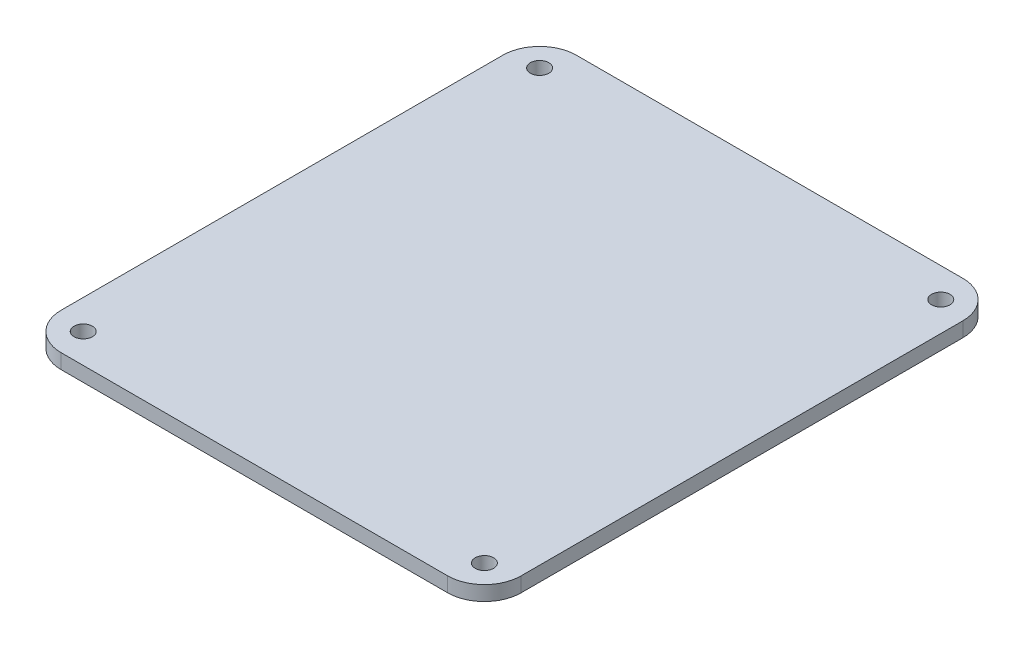
ISO-10303-21;
HEADER;
FILE_DESCRIPTION(('STEP AP214'),'2;1');
FILE_NAME('part.step','',(''),(''),'','','');
FILE_SCHEMA(('AUTOMOTIVE_DESIGN { 1 0 10303 214 1 1 1 1 }'));
ENDSEC;
DATA;
#1=APPLICATION_CONTEXT('core data for automotive mechanical design processes');
#2=APPLICATION_PROTOCOL_DEFINITION('international standard','automotive_design',2000,#1);
#3=PRODUCT_CONTEXT('',#1,'mechanical');
#4=PRODUCT('Part','Part','',(#3));
#5=PRODUCT_RELATED_PRODUCT_CATEGORY('part','',(#4));
#6=PRODUCT_DEFINITION_FORMATION('','',#4);
#7=PRODUCT_DEFINITION_CONTEXT('part definition',#1,'design');
#8=PRODUCT_DEFINITION('design','',#6,#7);
#9=PRODUCT_DEFINITION_SHAPE('','',#8);
#10=(LENGTH_UNIT() NAMED_UNIT(*) SI_UNIT(.MILLI.,.METRE.));
#11=(NAMED_UNIT(*) PLANE_ANGLE_UNIT() SI_UNIT($,.RADIAN.));
#12=(NAMED_UNIT(*) SI_UNIT($,.STERADIAN.) SOLID_ANGLE_UNIT());
#13=UNCERTAINTY_MEASURE_WITH_UNIT(LENGTH_MEASURE(1.E-05),#10,'distance_accuracy_value','');
#14=(GEOMETRIC_REPRESENTATION_CONTEXT(3) GLOBAL_UNCERTAINTY_ASSIGNED_CONTEXT((#13)) GLOBAL_UNIT_ASSIGNED_CONTEXT((#10,
#11,#12)) REPRESENTATION_CONTEXT('',''));
#15=CARTESIAN_POINT('',(0.,0.,0.));
#16=DIRECTION('',(0.,0.,1.));
#17=DIRECTION('',(1.,0.,0.));
#18=AXIS2_PLACEMENT_3D('',#15,#16,#17);
#19=CARTESIAN_POINT('',(62.5,4.,70.));
#20=DIRECTION('',(-1.,0.,0.));
#21=DIRECTION('',(0.,0.,1.));
#22=AXIS2_PLACEMENT_3D('',#19,#20,#21);
#23=PLANE('',#22);
#24=DIRECTION('',(0.,0.,-1.));
#25=VECTOR('',#24,1.);
#26=CARTESIAN_POINT('',(62.5,4.,70.));
#27=LINE('',#26,#25);
#28=CARTESIAN_POINT('',(62.5,4.,60.));
#29=VERTEX_POINT('',#28);
#30=CARTESIAN_POINT('',(62.5,4.,-60.));
#31=VERTEX_POINT('',#30);
#32=EDGE_CURVE('E126',#29,#31,#27,.T.);
#33=ORIENTED_EDGE('',*,*,#32,.F.);
#34=DIRECTION('',(0.,-1.,0.));
#35=VECTOR('',#34,1.);
#36=CARTESIAN_POINT('',(62.5,4.,60.));
#37=LINE('',#36,#35);
#38=CARTESIAN_POINT('',(62.5,0.,60.));
#39=VERTEX_POINT('',#38);
#40=EDGE_CURVE('E110',#29,#39,#37,.T.);
#41=ORIENTED_EDGE('',*,*,#40,.T.);
#42=DIRECTION('',(0.,0.,-1.));
#43=VECTOR('',#42,1.);
#44=CARTESIAN_POINT('',(62.5,0.,70.));
#45=LINE('',#44,#43);
#46=CARTESIAN_POINT('',(62.5,0.,-60.));
#47=VERTEX_POINT('',#46);
#48=EDGE_CURVE('E123',#39,#47,#45,.T.);
#49=ORIENTED_EDGE('',*,*,#48,.T.);
#50=DIRECTION('',(0.,-1.,0.));
#51=VECTOR('',#50,1.);
#52=CARTESIAN_POINT('',(62.5,4.,-60.));
#53=LINE('',#52,#51);
#54=EDGE_CURVE('E129',#47,#31,#53,.F.);
#55=ORIENTED_EDGE('',*,*,#54,.T.);
#56=EDGE_LOOP('',(#33,#41,#49,#55));
#57=FACE_BOUND('',#56,.T.);
#58=ADVANCED_FACE('F39',(#57),#23,.F.);
#59=CARTESIAN_POINT('',(-62.5,4.,-70.));
#60=DIRECTION('',(0.,0.,1.));
#61=DIRECTION('',(1.,0.,0.));
#62=AXIS2_PLACEMENT_3D('',#59,#60,#61);
#63=PLANE('',#62);
#64=DIRECTION('',(-1.,0.,0.));
#65=VECTOR('',#64,1.);
#66=CARTESIAN_POINT('',(-62.5,0.,-70.));
#67=LINE('',#66,#65);
#68=CARTESIAN_POINT('',(52.5,0.,-70.));
#69=VERTEX_POINT('',#68);
#70=CARTESIAN_POINT('',(-52.5,0.,-70.));
#71=VERTEX_POINT('',#70);
#72=EDGE_CURVE('E134',#69,#71,#67,.T.);
#73=ORIENTED_EDGE('',*,*,#72,.T.);
#74=DIRECTION('',(0.,-1.,0.));
#75=VECTOR('',#74,1.);
#76=CARTESIAN_POINT('',(-52.5,4.,-70.));
#77=LINE('',#76,#75);
#78=CARTESIAN_POINT('',(-52.5,4.,-70.));
#79=VERTEX_POINT('',#78);
#80=EDGE_CURVE('E11',#71,#79,#77,.F.);
#81=ORIENTED_EDGE('',*,*,#80,.T.);
#82=DIRECTION('',(-1.,0.,0.));
#83=VECTOR('',#82,1.);
#84=CARTESIAN_POINT('',(-62.5,4.,-70.));
#85=LINE('',#84,#83);
#86=CARTESIAN_POINT('',(52.5,4.,-70.));
#87=VERTEX_POINT('',#86);
#88=EDGE_CURVE('E191',#87,#79,#85,.T.);
#89=ORIENTED_EDGE('',*,*,#88,.F.);
#90=DIRECTION('',(0.,-1.,0.));
#91=VECTOR('',#90,1.);
#92=CARTESIAN_POINT('',(52.5,4.,-70.));
#93=LINE('',#92,#91);
#94=EDGE_CURVE('E48',#87,#69,#93,.T.);
#95=ORIENTED_EDGE('',*,*,#94,.T.);
#96=EDGE_LOOP('',(#73,#81,#89,#95));
#97=FACE_BOUND('',#96,.T.);
#98=ADVANCED_FACE('F189',(#97),#63,.F.);
#99=CARTESIAN_POINT('',(-62.5,4.,70.));
#100=DIRECTION('',(1.,0.,0.));
#101=DIRECTION('',(0.,0.,-1.));
#102=AXIS2_PLACEMENT_3D('',#99,#100,#101);
#103=PLANE('',#102);
#104=DIRECTION('',(0.,0.,1.));
#105=VECTOR('',#104,1.);
#106=CARTESIAN_POINT('',(-62.5,0.,70.));
#107=LINE('',#106,#105);
#108=CARTESIAN_POINT('',(-62.5,0.,-60.));
#109=VERTEX_POINT('',#108);
#110=CARTESIAN_POINT('',(-62.5,0.,60.));
#111=VERTEX_POINT('',#110);
#112=EDGE_CURVE('E140',#109,#111,#107,.T.);
#113=ORIENTED_EDGE('',*,*,#112,.T.);
#114=DIRECTION('',(0.,-1.,0.));
#115=VECTOR('',#114,1.);
#116=CARTESIAN_POINT('',(-62.5,4.,60.));
#117=LINE('',#116,#115);
#118=CARTESIAN_POINT('',(-62.5,4.,60.));
#119=VERTEX_POINT('',#118);
#120=EDGE_CURVE('E55',#111,#119,#117,.F.);
#121=ORIENTED_EDGE('',*,*,#120,.T.);
#122=DIRECTION('',(0.,0.,1.));
#123=VECTOR('',#122,1.);
#124=CARTESIAN_POINT('',(-62.5,4.,70.));
#125=LINE('',#124,#123);
#126=CARTESIAN_POINT('',(-62.5,4.,-60.));
#127=VERTEX_POINT('',#126);
#128=EDGE_CURVE('E199',#127,#119,#125,.T.);
#129=ORIENTED_EDGE('',*,*,#128,.F.);
#130=DIRECTION('',(0.,-1.,0.));
#131=VECTOR('',#130,1.);
#132=CARTESIAN_POINT('',(-62.5,4.,-60.));
#133=LINE('',#132,#131);
#134=EDGE_CURVE('E179',#127,#109,#133,.T.);
#135=ORIENTED_EDGE('',*,*,#134,.T.);
#136=EDGE_LOOP('',(#113,#121,#129,#135));
#137=FACE_BOUND('',#136,.T.);
#138=ADVANCED_FACE('F198',(#137),#103,.F.);
#139=CARTESIAN_POINT('',(-62.5,4.,70.));
#140=DIRECTION('',(0.,0.,-1.));
#141=DIRECTION('',(-1.,0.,0.));
#142=AXIS2_PLACEMENT_3D('',#139,#140,#141);
#143=PLANE('',#142);
#144=DIRECTION('',(1.,0.,0.));
#145=VECTOR('',#144,1.);
#146=CARTESIAN_POINT('',(-62.5,0.,70.));
#147=LINE('',#146,#145);
#148=CARTESIAN_POINT('',(-52.5,0.,70.));
#149=VERTEX_POINT('',#148);
#150=CARTESIAN_POINT('',(52.5,0.,70.));
#151=VERTEX_POINT('',#150);
#152=EDGE_CURVE('E151',#149,#151,#147,.T.);
#153=ORIENTED_EDGE('',*,*,#152,.T.);
#154=DIRECTION('',(0.,-1.,0.));
#155=VECTOR('',#154,1.);
#156=CARTESIAN_POINT('',(52.5,4.,70.));
#157=LINE('',#156,#155);
#158=CARTESIAN_POINT('',(52.5,4.,70.));
#159=VERTEX_POINT('',#158);
#160=EDGE_CURVE('E111',#151,#159,#157,.F.);
#161=ORIENTED_EDGE('',*,*,#160,.T.);
#162=DIRECTION('',(1.,0.,0.));
#163=VECTOR('',#162,1.);
#164=CARTESIAN_POINT('',(-62.5,4.,70.));
#165=LINE('',#164,#163);
#166=CARTESIAN_POINT('',(-52.5,4.,70.));
#167=VERTEX_POINT('',#166);
#168=EDGE_CURVE('E146',#167,#159,#165,.T.);
#169=ORIENTED_EDGE('',*,*,#168,.F.);
#170=DIRECTION('',(0.,-1.,0.));
#171=VECTOR('',#170,1.);
#172=CARTESIAN_POINT('',(-52.5,4.,70.));
#173=LINE('',#172,#171);
#174=EDGE_CURVE('E117',#167,#149,#173,.T.);
#175=ORIENTED_EDGE('',*,*,#174,.T.);
#176=EDGE_LOOP('',(#153,#161,#169,#175));
#177=FACE_BOUND('',#176,.T.);
#178=ADVANCED_FACE('F242',(#177),#143,.F.);
#179=CARTESIAN_POINT('',(0.,4.,0.));
#180=DIRECTION('',(0.,-1.,0.));
#181=DIRECTION('',(0.,0.,-1.));
#182=AXIS2_PLACEMENT_3D('',#179,#180,#181);
#183=PLANE('',#182);
#184=CARTESIAN_POINT('',(54.5,4.,-62.));
#185=DIRECTION('',(0.,1.,0.));
#186=DIRECTION('',(0.,0.,1.));
#187=AXIS2_PLACEMENT_3D('',#184,#185,#186);
#188=CIRCLE('',#187,2.5);
#189=CARTESIAN_POINT('',(54.5,4.,-59.5));
#190=VERTEX_POINT('',#189);
#191=EDGE_CURVE('E211',#190,#190,#188,.T.);
#192=ORIENTED_EDGE('',*,*,#191,.F.);
#193=EDGE_LOOP('',(#192));
#194=FACE_BOUND('',#193,.T.);
#195=CARTESIAN_POINT('',(-54.5,4.,62.));
#196=DIRECTION('',(0.,1.,0.));
#197=DIRECTION('',(0.,0.,1.));
#198=AXIS2_PLACEMENT_3D('',#195,#196,#197);
#199=CIRCLE('',#198,2.5);
#200=CARTESIAN_POINT('',(-54.5,4.,64.5));
#201=VERTEX_POINT('',#200);
#202=EDGE_CURVE('E217',#201,#201,#199,.T.);
#203=ORIENTED_EDGE('',*,*,#202,.F.);
#204=EDGE_LOOP('',(#203));
#205=FACE_BOUND('',#204,.T.);
#206=CARTESIAN_POINT('',(54.5,4.,62.));
#207=DIRECTION('',(0.,1.,0.));
#208=DIRECTION('',(0.,0.,1.));
#209=AXIS2_PLACEMENT_3D('',#206,#207,#208);
#210=CIRCLE('',#209,2.5);
#211=CARTESIAN_POINT('',(54.5,4.,64.5));
#212=VERTEX_POINT('',#211);
#213=EDGE_CURVE('E218',#212,#212,#210,.T.);
#214=ORIENTED_EDGE('',*,*,#213,.F.);
#215=EDGE_LOOP('',(#214));
#216=FACE_BOUND('',#215,.T.);
#217=CARTESIAN_POINT('',(-54.5,4.,-62.));
#218=DIRECTION('',(0.,1.,0.));
#219=DIRECTION('',(0.,0.,1.));
#220=AXIS2_PLACEMENT_3D('',#217,#218,#219);
#221=CIRCLE('',#220,2.5);
#222=CARTESIAN_POINT('',(-54.5,4.,-59.5));
#223=VERTEX_POINT('',#222);
#224=EDGE_CURVE('E143',#223,#223,#221,.T.);
#225=ORIENTED_EDGE('',*,*,#224,.F.);
#226=EDGE_LOOP('',(#225));
#227=FACE_BOUND('',#226,.T.);
#228=ORIENTED_EDGE('',*,*,#168,.T.);
#229=CARTESIAN_POINT('',(52.5,4.,60.));
#230=DIRECTION('',(0.,-1.,0.));
#231=DIRECTION('',(0.,0.,-1.));
#232=AXIS2_PLACEMENT_3D('',#229,#230,#231);
#233=CIRCLE('',#232,10.);
#234=EDGE_CURVE('E176',#159,#29,#233,.F.);
#235=ORIENTED_EDGE('',*,*,#234,.T.);
#236=ORIENTED_EDGE('',*,*,#32,.T.);
#237=CARTESIAN_POINT('',(52.5,4.,-60.));
#238=DIRECTION('',(0.,-1.,0.));
#239=DIRECTION('',(0.,0.,-1.));
#240=AXIS2_PLACEMENT_3D('',#237,#238,#239);
#241=CIRCLE('',#240,10.);
#242=EDGE_CURVE('E168',#31,#87,#241,.F.);
#243=ORIENTED_EDGE('',*,*,#242,.T.);
#244=ORIENTED_EDGE('',*,*,#88,.T.);
#245=CARTESIAN_POINT('',(-52.5,4.,-60.));
#246=DIRECTION('',(0.,-1.,0.));
#247=DIRECTION('',(0.,0.,-1.));
#248=AXIS2_PLACEMENT_3D('',#245,#246,#247);
#249=CIRCLE('',#248,10.);
#250=EDGE_CURVE('E62',#79,#127,#249,.F.);
#251=ORIENTED_EDGE('',*,*,#250,.T.);
#252=ORIENTED_EDGE('',*,*,#128,.T.);
#253=CARTESIAN_POINT('',(-52.5,4.,60.));
#254=DIRECTION('',(0.,-1.,0.));
#255=DIRECTION('',(0.,0.,-1.));
#256=AXIS2_PLACEMENT_3D('',#253,#254,#255);
#257=CIRCLE('',#256,10.);
#258=EDGE_CURVE('E173',#119,#167,#257,.F.);
#259=ORIENTED_EDGE('',*,*,#258,.T.);
#260=EDGE_LOOP('',(#228,#235,#236,#243,#244,#251,#252,#259));
#261=FACE_BOUND('',#260,.T.);
#262=ADVANCED_FACE('F239',(#194,#205,#216,#227,#261),#183,.F.);
#263=CARTESIAN_POINT('',(0.,0.,0.));
#264=DIRECTION('',(0.,-1.,0.));
#265=DIRECTION('',(0.,0.,-1.));
#266=AXIS2_PLACEMENT_3D('',#263,#264,#265);
#267=PLANE('',#266);
#268=CARTESIAN_POINT('',(54.5,0.,-62.));
#269=DIRECTION('',(0.,1.,0.));
#270=DIRECTION('',(0.,0.,1.));
#271=AXIS2_PLACEMENT_3D('',#268,#269,#270);
#272=CIRCLE('',#271,2.5);
#273=CARTESIAN_POINT('',(54.5,0.,-59.5));
#274=VERTEX_POINT('',#273);
#275=EDGE_CURVE('E222',#274,#274,#272,.T.);
#276=ORIENTED_EDGE('',*,*,#275,.T.);
#277=EDGE_LOOP('',(#276));
#278=FACE_BOUND('',#277,.T.);
#279=CARTESIAN_POINT('',(-54.5,0.,62.));
#280=DIRECTION('',(0.,1.,0.));
#281=DIRECTION('',(0.,0.,1.));
#282=AXIS2_PLACEMENT_3D('',#279,#280,#281);
#283=CIRCLE('',#282,2.5);
#284=CARTESIAN_POINT('',(-54.5,0.,64.5));
#285=VERTEX_POINT('',#284);
#286=EDGE_CURVE('E213',#285,#285,#283,.T.);
#287=ORIENTED_EDGE('',*,*,#286,.T.);
#288=EDGE_LOOP('',(#287));
#289=FACE_BOUND('',#288,.T.);
#290=CARTESIAN_POINT('',(54.5,0.,62.));
#291=DIRECTION('',(0.,1.,0.));
#292=DIRECTION('',(0.,0.,1.));
#293=AXIS2_PLACEMENT_3D('',#290,#291,#292);
#294=CIRCLE('',#293,2.5);
#295=CARTESIAN_POINT('',(54.5,0.,64.5));
#296=VERTEX_POINT('',#295);
#297=EDGE_CURVE('E229',#296,#296,#294,.T.);
#298=ORIENTED_EDGE('',*,*,#297,.T.);
#299=EDGE_LOOP('',(#298));
#300=FACE_BOUND('',#299,.T.);
#301=CARTESIAN_POINT('',(-54.5,0.,-62.));
#302=DIRECTION('',(0.,1.,0.));
#303=DIRECTION('',(0.,0.,1.));
#304=AXIS2_PLACEMENT_3D('',#301,#302,#303);
#305=CIRCLE('',#304,2.5);
#306=CARTESIAN_POINT('',(-54.5,0.,-59.5));
#307=VERTEX_POINT('',#306);
#308=EDGE_CURVE('E135',#307,#307,#305,.T.);
#309=ORIENTED_EDGE('',*,*,#308,.T.);
#310=EDGE_LOOP('',(#309));
#311=FACE_BOUND('',#310,.T.);
#312=ORIENTED_EDGE('',*,*,#48,.F.);
#313=CARTESIAN_POINT('',(52.5,0.,60.));
#314=DIRECTION('',(0.,-1.,0.));
#315=DIRECTION('',(0.,0.,-1.));
#316=AXIS2_PLACEMENT_3D('',#313,#314,#315);
#317=CIRCLE('',#316,10.);
#318=EDGE_CURVE('E106',#39,#151,#317,.T.);
#319=ORIENTED_EDGE('',*,*,#318,.T.);
#320=ORIENTED_EDGE('',*,*,#152,.F.);
#321=CARTESIAN_POINT('',(-52.5,0.,60.));
#322=DIRECTION('',(0.,-1.,0.));
#323=DIRECTION('',(0.,0.,-1.));
#324=AXIS2_PLACEMENT_3D('',#321,#322,#323);
#325=CIRCLE('',#324,10.);
#326=EDGE_CURVE('E118',#149,#111,#325,.T.);
#327=ORIENTED_EDGE('',*,*,#326,.T.);
#328=ORIENTED_EDGE('',*,*,#112,.F.);
#329=CARTESIAN_POINT('',(-52.5,0.,-60.));
#330=DIRECTION('',(0.,-1.,0.));
#331=DIRECTION('',(0.,0.,-1.));
#332=AXIS2_PLACEMENT_3D('',#329,#330,#331);
#333=CIRCLE('',#332,10.);
#334=EDGE_CURVE('E158',#109,#71,#333,.T.);
#335=ORIENTED_EDGE('',*,*,#334,.T.);
#336=ORIENTED_EDGE('',*,*,#72,.F.);
#337=CARTESIAN_POINT('',(52.5,0.,-60.));
#338=DIRECTION('',(0.,-1.,0.));
#339=DIRECTION('',(0.,0.,-1.));
#340=AXIS2_PLACEMENT_3D('',#337,#338,#339);
#341=CIRCLE('',#340,10.);
#342=EDGE_CURVE('E128',#69,#47,#341,.T.);
#343=ORIENTED_EDGE('',*,*,#342,.T.);
#344=EDGE_LOOP('',(#312,#319,#320,#327,#328,#335,#336,#343));
#345=FACE_BOUND('',#344,.T.);
#346=ADVANCED_FACE('F131',(#278,#289,#300,#311,#345),#267,.T.);
#347=CARTESIAN_POINT('',(-54.5,0.,-62.));
#348=DIRECTION('',(0.,1.,0.));
#349=DIRECTION('',(0.,0.,1.));
#350=AXIS2_PLACEMENT_3D('',#347,#348,#349);
#351=CYLINDRICAL_SURFACE('',#350,2.5);
#352=ORIENTED_EDGE('',*,*,#308,.F.);
#353=EDGE_LOOP('',(#352));
#354=FACE_BOUND('',#353,.T.);
#355=ORIENTED_EDGE('',*,*,#224,.T.);
#356=EDGE_LOOP('',(#355));
#357=FACE_BOUND('',#356,.T.);
#358=ADVANCED_FACE('F271',(#354,#357),#351,.F.);
#359=CARTESIAN_POINT('',(54.5,0.,62.));
#360=DIRECTION('',(0.,1.,0.));
#361=DIRECTION('',(0.,0.,1.));
#362=AXIS2_PLACEMENT_3D('',#359,#360,#361);
#363=CYLINDRICAL_SURFACE('',#362,2.5);
#364=ORIENTED_EDGE('',*,*,#297,.F.);
#365=EDGE_LOOP('',(#364));
#366=FACE_BOUND('',#365,.T.);
#367=ORIENTED_EDGE('',*,*,#213,.T.);
#368=EDGE_LOOP('',(#367));
#369=FACE_BOUND('',#368,.T.);
#370=ADVANCED_FACE('F237',(#366,#369),#363,.F.);
#371=CARTESIAN_POINT('',(-54.5,0.,62.));
#372=DIRECTION('',(0.,1.,0.));
#373=DIRECTION('',(0.,0.,1.));
#374=AXIS2_PLACEMENT_3D('',#371,#372,#373);
#375=CYLINDRICAL_SURFACE('',#374,2.5);
#376=ORIENTED_EDGE('',*,*,#286,.F.);
#377=EDGE_LOOP('',(#376));
#378=FACE_BOUND('',#377,.T.);
#379=ORIENTED_EDGE('',*,*,#202,.T.);
#380=EDGE_LOOP('',(#379));
#381=FACE_BOUND('',#380,.T.);
#382=ADVANCED_FACE('F277',(#378,#381),#375,.F.);
#383=CARTESIAN_POINT('',(54.5,0.,-62.));
#384=DIRECTION('',(0.,1.,0.));
#385=DIRECTION('',(0.,0.,1.));
#386=AXIS2_PLACEMENT_3D('',#383,#384,#385);
#387=CYLINDRICAL_SURFACE('',#386,2.5);
#388=ORIENTED_EDGE('',*,*,#275,.F.);
#389=EDGE_LOOP('',(#388));
#390=FACE_BOUND('',#389,.T.);
#391=ORIENTED_EDGE('',*,*,#191,.T.);
#392=EDGE_LOOP('',(#391));
#393=FACE_BOUND('',#392,.T.);
#394=ADVANCED_FACE('F257',(#390,#393),#387,.F.);
#395=CARTESIAN_POINT('',(52.5,4.,60.));
#396=DIRECTION('',(0.,-1.,0.));
#397=DIRECTION('',(0.,0.,-1.));
#398=AXIS2_PLACEMENT_3D('',#395,#396,#397);
#399=CYLINDRICAL_SURFACE('',#398,10.);
#400=ORIENTED_EDGE('',*,*,#234,.F.);
#401=ORIENTED_EDGE('',*,*,#160,.F.);
#402=ORIENTED_EDGE('',*,*,#318,.F.);
#403=ORIENTED_EDGE('',*,*,#40,.F.);
#404=EDGE_LOOP('',(#400,#401,#402,#403));
#405=FACE_BOUND('',#404,.T.);
#406=ADVANCED_FACE('F109',(#405),#399,.T.);
#407=CARTESIAN_POINT('',(-52.5,4.,60.));
#408=DIRECTION('',(0.,-1.,0.));
#409=DIRECTION('',(0.,0.,-1.));
#410=AXIS2_PLACEMENT_3D('',#407,#408,#409);
#411=CYLINDRICAL_SURFACE('',#410,10.);
#412=ORIENTED_EDGE('',*,*,#258,.F.);
#413=ORIENTED_EDGE('',*,*,#120,.F.);
#414=ORIENTED_EDGE('',*,*,#326,.F.);
#415=ORIENTED_EDGE('',*,*,#174,.F.);
#416=EDGE_LOOP('',(#412,#413,#414,#415));
#417=FACE_BOUND('',#416,.T.);
#418=ADVANCED_FACE('F250',(#417),#411,.T.);
#419=CARTESIAN_POINT('',(-52.5,4.,-60.));
#420=DIRECTION('',(0.,-1.,0.));
#421=DIRECTION('',(0.,0.,-1.));
#422=AXIS2_PLACEMENT_3D('',#419,#420,#421);
#423=CYLINDRICAL_SURFACE('',#422,10.);
#424=ORIENTED_EDGE('',*,*,#250,.F.);
#425=ORIENTED_EDGE('',*,*,#80,.F.);
#426=ORIENTED_EDGE('',*,*,#334,.F.);
#427=ORIENTED_EDGE('',*,*,#134,.F.);
#428=EDGE_LOOP('',(#424,#425,#426,#427));
#429=FACE_BOUND('',#428,.T.);
#430=ADVANCED_FACE('F197',(#429),#423,.T.);
#431=CARTESIAN_POINT('',(52.5,4.,-60.));
#432=DIRECTION('',(0.,-1.,0.));
#433=DIRECTION('',(0.,0.,-1.));
#434=AXIS2_PLACEMENT_3D('',#431,#432,#433);
#435=CYLINDRICAL_SURFACE('',#434,10.);
#436=ORIENTED_EDGE('',*,*,#242,.F.);
#437=ORIENTED_EDGE('',*,*,#54,.F.);
#438=ORIENTED_EDGE('',*,*,#342,.F.);
#439=ORIENTED_EDGE('',*,*,#94,.F.);
#440=EDGE_LOOP('',(#436,#437,#438,#439));
#441=FACE_BOUND('',#440,.T.);
#442=ADVANCED_FACE('F41',(#441),#435,.T.);
#443=CLOSED_SHELL('',(#58,#98,#138,#178,#262,#346,#358,#370,#382,#394,#406,#418,#430,#442));
#444=MANIFOLD_SOLID_BREP('B2',#443);
#445=ADVANCED_BREP_SHAPE_REPRESENTATION('',(#18,#444),#14);
#446=SHAPE_DEFINITION_REPRESENTATION(#9,#445);
ENDSEC;
END-ISO-10303-21;
